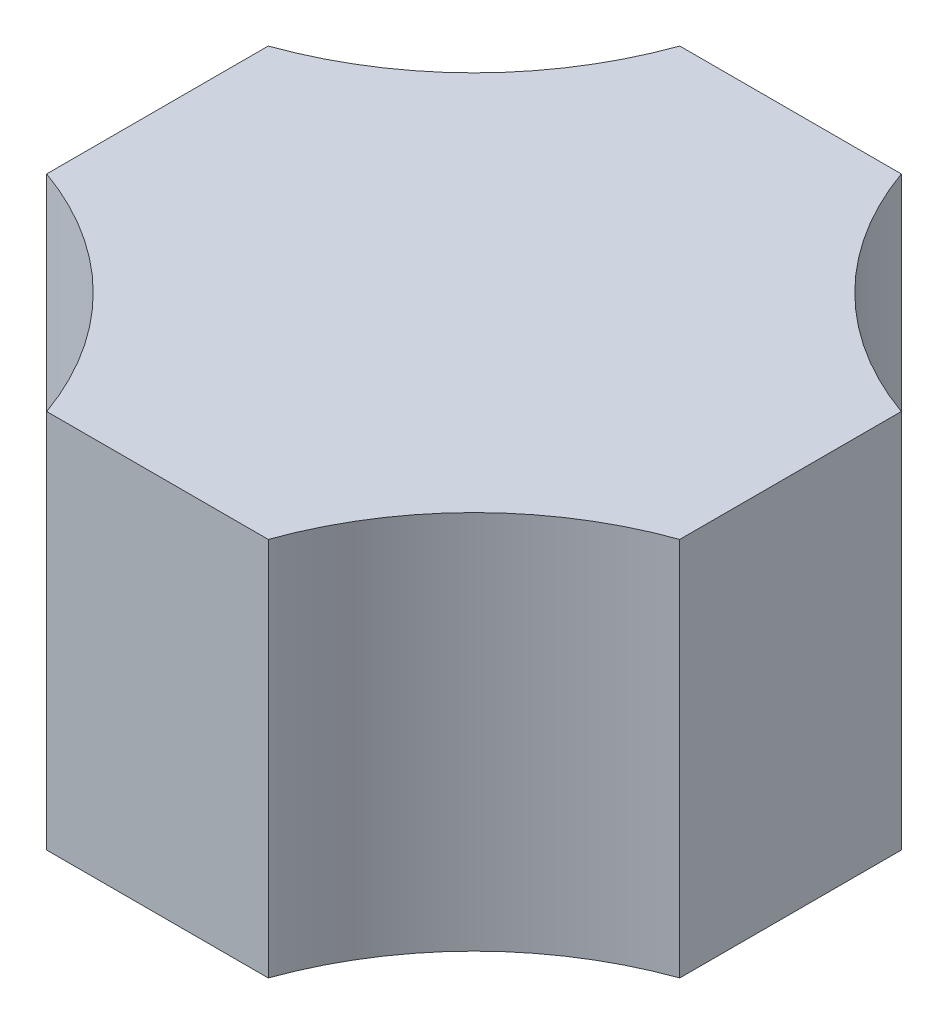
ISO-10303-21;
HEADER;
FILE_DESCRIPTION(('STEP AP214'),'2;1');
FILE_NAME('part.step','',(''),(''),'','','');
FILE_SCHEMA(('AUTOMOTIVE_DESIGN { 1 0 10303 214 1 1 1 1 }'));
ENDSEC;
DATA;
#1=APPLICATION_CONTEXT('core data for automotive mechanical design processes');
#2=APPLICATION_PROTOCOL_DEFINITION('international standard','automotive_design',2000,#1);
#3=PRODUCT_CONTEXT('',#1,'mechanical');
#4=PRODUCT('Part','Part','',(#3));
#5=PRODUCT_RELATED_PRODUCT_CATEGORY('part','',(#4));
#6=PRODUCT_DEFINITION_FORMATION('','',#4);
#7=PRODUCT_DEFINITION_CONTEXT('part definition',#1,'design');
#8=PRODUCT_DEFINITION('design','',#6,#7);
#9=PRODUCT_DEFINITION_SHAPE('','',#8);
#10=(LENGTH_UNIT() NAMED_UNIT(*) SI_UNIT(.MILLI.,.METRE.));
#11=(NAMED_UNIT(*) PLANE_ANGLE_UNIT() SI_UNIT($,.RADIAN.));
#12=(NAMED_UNIT(*) SI_UNIT($,.STERADIAN.) SOLID_ANGLE_UNIT());
#13=UNCERTAINTY_MEASURE_WITH_UNIT(LENGTH_MEASURE(1.E-05),#10,'distance_accuracy_value','');
#14=(GEOMETRIC_REPRESENTATION_CONTEXT(3) GLOBAL_UNCERTAINTY_ASSIGNED_CONTEXT((#13)) GLOBAL_UNIT_ASSIGNED_CONTEXT((#10,
#11,#12)) REPRESENTATION_CONTEXT('',''));
#15=CARTESIAN_POINT('',(0.,0.,0.));
#16=DIRECTION('',(0.,0.,1.));
#17=DIRECTION('',(1.,0.,0.));
#18=AXIS2_PLACEMENT_3D('',#15,#16,#17);
#19=CARTESIAN_POINT('',(-15.3850818282959,-15.24,-25.4));
#20=DIRECTION('',(0.,0.,1.));
#21=DIRECTION('',(1.,0.,0.));
#22=AXIS2_PLACEMENT_3D('',#19,#20,#21);
#23=PLANE('',#22);
#24=DIRECTION('',(1.,0.,0.));
#25=VECTOR('',#24,1.);
#26=CARTESIAN_POINT('',(-15.3850818282959,0.,-25.4));
#27=LINE('',#26,#25);
#28=CARTESIAN_POINT('',(8.255,0.,-25.4));
#29=VERTEX_POINT('',#28);
#30=CARTESIAN_POINT('',(17.145,0.,-25.4));
#31=VERTEX_POINT('',#30);
#32=EDGE_CURVE('E129',#29,#31,#27,.T.);
#33=ORIENTED_EDGE('',*,*,#32,.T.);
#34=DIRECTION('',(0.,1.,0.));
#35=VECTOR('',#34,1.);
#36=CARTESIAN_POINT('',(17.145,-15.24,-25.4));
#37=LINE('',#36,#35);
#38=CARTESIAN_POINT('',(17.145,-15.24,-25.4));
#39=VERTEX_POINT('',#38);
#40=EDGE_CURVE('E11',#39,#31,#37,.T.);
#41=ORIENTED_EDGE('',*,*,#40,.F.);
#42=DIRECTION('',(1.,0.,0.));
#43=VECTOR('',#42,1.);
#44=CARTESIAN_POINT('',(-15.3850818282959,-15.24,-25.4));
#45=LINE('',#44,#43);
#46=CARTESIAN_POINT('',(8.255,-15.24,-25.4));
#47=VERTEX_POINT('',#46);
#48=EDGE_CURVE('E145',#47,#39,#45,.T.);
#49=ORIENTED_EDGE('',*,*,#48,.F.);
#50=DIRECTION('',(0.,1.,0.));
#51=VECTOR('',#50,1.);
#52=CARTESIAN_POINT('',(8.255,-15.24,-25.4));
#53=LINE('',#52,#51);
#54=EDGE_CURVE('E36',#47,#29,#53,.T.);
#55=ORIENTED_EDGE('',*,*,#54,.T.);
#56=EDGE_LOOP('',(#33,#41,#49,#55));
#57=FACE_BOUND('',#56,.T.);
#58=ADVANCED_FACE('F33',(#57),#23,.F.);
#59=CARTESIAN_POINT('',(29.9332120435619,-15.24,-29.9332120435619));
#60=DIRECTION('',(0.,1.,0.));
#61=DIRECTION('',(0.,0.,1.));
#62=AXIS2_PLACEMENT_3D('',#59,#60,#61);
#63=CYLINDRICAL_SURFACE('',#62,13.5679172573758);
#64=CARTESIAN_POINT('',(29.9332120435619,0.,-29.9332120435619));
#65=DIRECTION('',(0.,1.,0.));
#66=DIRECTION('',(0.,0.,1.));
#67=AXIS2_PLACEMENT_3D('',#64,#65,#66);
#68=CIRCLE('',#67,13.5679172573758);
#69=CARTESIAN_POINT('',(25.4,0.,-17.145));
#70=VERTEX_POINT('',#69);
#71=EDGE_CURVE('E76',#31,#70,#68,.T.);
#72=ORIENTED_EDGE('',*,*,#71,.T.);
#73=DIRECTION('',(0.,1.,0.));
#74=VECTOR('',#73,1.);
#75=CARTESIAN_POINT('',(25.4,-15.24,-17.145));
#76=LINE('',#75,#74);
#77=CARTESIAN_POINT('',(25.4,-15.24,-17.145));
#78=VERTEX_POINT('',#77);
#79=EDGE_CURVE('E42',#78,#70,#76,.T.);
#80=ORIENTED_EDGE('',*,*,#79,.F.);
#81=CARTESIAN_POINT('',(29.9332120435619,-15.24,-29.9332120435619));
#82=DIRECTION('',(0.,1.,0.));
#83=DIRECTION('',(0.,0.,1.));
#84=AXIS2_PLACEMENT_3D('',#81,#82,#83);
#85=CIRCLE('',#84,13.5679172573758);
#86=EDGE_CURVE('E50',#39,#78,#85,.T.);
#87=ORIENTED_EDGE('',*,*,#86,.F.);
#88=ORIENTED_EDGE('',*,*,#40,.T.);
#89=EDGE_LOOP('',(#72,#80,#87,#88));
#90=FACE_BOUND('',#89,.T.);
#91=ADVANCED_FACE('F173',(#90),#63,.F.);
#92=CARTESIAN_POINT('',(25.4,-15.24,-12.7));
#93=DIRECTION('',(-1.,0.,0.));
#94=DIRECTION('',(0.,0.,1.));
#95=AXIS2_PLACEMENT_3D('',#92,#93,#94);
#96=PLANE('',#95);
#97=DIRECTION('',(0.,0.,1.));
#98=VECTOR('',#97,1.);
#99=CARTESIAN_POINT('',(25.4,0.,-12.7));
#100=LINE('',#99,#98);
#101=CARTESIAN_POINT('',(25.4,0.,-8.255));
#102=VERTEX_POINT('',#101);
#103=EDGE_CURVE('E114',#70,#102,#100,.T.);
#104=ORIENTED_EDGE('',*,*,#103,.T.);
#105=DIRECTION('',(0.,1.,0.));
#106=VECTOR('',#105,1.);
#107=CARTESIAN_POINT('',(25.4,-15.24,-8.255));
#108=LINE('',#107,#106);
#109=CARTESIAN_POINT('',(25.4,-15.24,-8.255));
#110=VERTEX_POINT('',#109);
#111=EDGE_CURVE('E112',#110,#102,#108,.T.);
#112=ORIENTED_EDGE('',*,*,#111,.F.);
#113=DIRECTION('',(0.,0.,1.));
#114=VECTOR('',#113,1.);
#115=CARTESIAN_POINT('',(25.4,-15.24,-12.7));
#116=LINE('',#115,#114);
#117=EDGE_CURVE('E104',#78,#110,#116,.T.);
#118=ORIENTED_EDGE('',*,*,#117,.F.);
#119=ORIENTED_EDGE('',*,*,#79,.T.);
#120=EDGE_LOOP('',(#104,#112,#118,#119));
#121=FACE_BOUND('',#120,.T.);
#122=ADVANCED_FACE('F113',(#121),#96,.F.);
#123=CARTESIAN_POINT('',(29.9332120435619,-15.24,4.53321204356189));
#124=DIRECTION('',(0.,1.,0.));
#125=DIRECTION('',(0.,0.,1.));
#126=AXIS2_PLACEMENT_3D('',#123,#124,#125);
#127=CYLINDRICAL_SURFACE('',#126,13.5679172573758);
#128=CARTESIAN_POINT('',(29.9332120435619,0.,4.53321204356189));
#129=DIRECTION('',(0.,1.,0.));
#130=DIRECTION('',(0.,0.,1.));
#131=AXIS2_PLACEMENT_3D('',#128,#129,#130);
#132=CIRCLE('',#131,13.5679172573758);
#133=CARTESIAN_POINT('',(17.145,0.,0.));
#134=VERTEX_POINT('',#133);
#135=EDGE_CURVE('E142',#134,#102,#132,.F.);
#136=ORIENTED_EDGE('',*,*,#135,.F.);
#137=DIRECTION('',(0.,1.,0.));
#138=VECTOR('',#137,1.);
#139=CARTESIAN_POINT('',(17.145,-15.24,0.));
#140=LINE('',#139,#138);
#141=CARTESIAN_POINT('',(17.145,-15.24,0.));
#142=VERTEX_POINT('',#141);
#143=EDGE_CURVE('E118',#142,#134,#140,.T.);
#144=ORIENTED_EDGE('',*,*,#143,.F.);
#145=CARTESIAN_POINT('',(29.9332120435619,-15.24,4.53321204356189));
#146=DIRECTION('',(0.,1.,0.));
#147=DIRECTION('',(0.,0.,1.));
#148=AXIS2_PLACEMENT_3D('',#145,#146,#147);
#149=CIRCLE('',#148,13.5679172573758);
#150=EDGE_CURVE('E108',#142,#110,#149,.F.);
#151=ORIENTED_EDGE('',*,*,#150,.T.);
#152=ORIENTED_EDGE('',*,*,#111,.T.);
#153=EDGE_LOOP('',(#136,#144,#151,#152));
#154=FACE_BOUND('',#153,.T.);
#155=ADVANCED_FACE('F120',(#154),#127,.F.);
#156=CARTESIAN_POINT('',(-15.3850818282959,-15.24,0.));
#157=DIRECTION('',(0.,0.,-1.));
#158=DIRECTION('',(-1.,0.,0.));
#159=AXIS2_PLACEMENT_3D('',#156,#157,#158);
#160=PLANE('',#159);
#161=DIRECTION('',(-1.,0.,0.));
#162=VECTOR('',#161,1.);
#163=CARTESIAN_POINT('',(-15.3850818282959,0.,0.));
#164=LINE('',#163,#162);
#165=CARTESIAN_POINT('',(8.255,0.,0.));
#166=VERTEX_POINT('',#165);
#167=EDGE_CURVE('E140',#134,#166,#164,.T.);
#168=ORIENTED_EDGE('',*,*,#167,.T.);
#169=DIRECTION('',(0.,1.,0.));
#170=VECTOR('',#169,1.);
#171=CARTESIAN_POINT('',(8.255,-15.24,0.));
#172=LINE('',#171,#170);
#173=CARTESIAN_POINT('',(8.255,-15.24,0.));
#174=VERTEX_POINT('',#173);
#175=EDGE_CURVE('E149',#174,#166,#172,.T.);
#176=ORIENTED_EDGE('',*,*,#175,.F.);
#177=DIRECTION('',(-1.,0.,0.));
#178=VECTOR('',#177,1.);
#179=CARTESIAN_POINT('',(-15.3850818282959,-15.24,0.));
#180=LINE('',#179,#178);
#181=EDGE_CURVE('E122',#142,#174,#180,.T.);
#182=ORIENTED_EDGE('',*,*,#181,.F.);
#183=ORIENTED_EDGE('',*,*,#143,.T.);
#184=EDGE_LOOP('',(#168,#176,#182,#183));
#185=FACE_BOUND('',#184,.T.);
#186=ADVANCED_FACE('F186',(#185),#160,.F.);
#187=CARTESIAN_POINT('',(-4.53321204356189,-15.24,4.53321204356189));
#188=DIRECTION('',(0.,1.,0.));
#189=DIRECTION('',(0.,0.,1.));
#190=AXIS2_PLACEMENT_3D('',#187,#188,#189);
#191=CYLINDRICAL_SURFACE('',#190,13.5679172573758);
#192=CARTESIAN_POINT('',(-4.53321204356189,0.,4.53321204356189));
#193=DIRECTION('',(0.,1.,0.));
#194=DIRECTION('',(0.,0.,1.));
#195=AXIS2_PLACEMENT_3D('',#192,#193,#194);
#196=CIRCLE('',#195,13.5679172573758);
#197=CARTESIAN_POINT('',(0.,0.,-8.255));
#198=VERTEX_POINT('',#197);
#199=EDGE_CURVE('E138',#166,#198,#196,.T.);
#200=ORIENTED_EDGE('',*,*,#199,.T.);
#201=DIRECTION('',(0.,1.,0.));
#202=VECTOR('',#201,1.);
#203=CARTESIAN_POINT('',(0.,-15.24,-8.255));
#204=LINE('',#203,#202);
#205=CARTESIAN_POINT('',(0.,-15.24,-8.255));
#206=VERTEX_POINT('',#205);
#207=EDGE_CURVE('E152',#206,#198,#204,.T.);
#208=ORIENTED_EDGE('',*,*,#207,.F.);
#209=CARTESIAN_POINT('',(-4.53321204356189,-15.24,4.53321204356189));
#210=DIRECTION('',(0.,1.,0.));
#211=DIRECTION('',(0.,0.,1.));
#212=AXIS2_PLACEMENT_3D('',#209,#210,#211);
#213=CIRCLE('',#212,13.5679172573758);
#214=EDGE_CURVE('E124',#174,#206,#213,.T.);
#215=ORIENTED_EDGE('',*,*,#214,.F.);
#216=ORIENTED_EDGE('',*,*,#175,.T.);
#217=EDGE_LOOP('',(#200,#208,#215,#216));
#218=FACE_BOUND('',#217,.T.);
#219=ADVANCED_FACE('F169',(#218),#191,.F.);
#220=CARTESIAN_POINT('',(0.,-15.24,-12.7));
#221=DIRECTION('',(1.,0.,0.));
#222=DIRECTION('',(0.,0.,-1.));
#223=AXIS2_PLACEMENT_3D('',#220,#221,#222);
#224=PLANE('',#223);
#225=DIRECTION('',(0.,0.,-1.));
#226=VECTOR('',#225,1.);
#227=CARTESIAN_POINT('',(0.,0.,-12.7));
#228=LINE('',#227,#226);
#229=CARTESIAN_POINT('',(0.,0.,-17.145));
#230=VERTEX_POINT('',#229);
#231=EDGE_CURVE('E135',#198,#230,#228,.T.);
#232=ORIENTED_EDGE('',*,*,#231,.T.);
#233=DIRECTION('',(0.,1.,0.));
#234=VECTOR('',#233,1.);
#235=CARTESIAN_POINT('',(0.,-15.24,-17.145));
#236=LINE('',#235,#234);
#237=CARTESIAN_POINT('',(0.,-15.24,-17.145));
#238=VERTEX_POINT('',#237);
#239=EDGE_CURVE('E154',#238,#230,#236,.T.);
#240=ORIENTED_EDGE('',*,*,#239,.F.);
#241=DIRECTION('',(0.,0.,-1.));
#242=VECTOR('',#241,1.);
#243=CARTESIAN_POINT('',(0.,-15.24,-12.7));
#244=LINE('',#243,#242);
#245=EDGE_CURVE('E200',#206,#238,#244,.T.);
#246=ORIENTED_EDGE('',*,*,#245,.F.);
#247=ORIENTED_EDGE('',*,*,#207,.T.);
#248=EDGE_LOOP('',(#232,#240,#246,#247));
#249=FACE_BOUND('',#248,.T.);
#250=ADVANCED_FACE('F163',(#249),#224,.F.);
#251=CARTESIAN_POINT('',(-4.53321204356189,-15.24,-29.9332120435619));
#252=DIRECTION('',(0.,1.,0.));
#253=DIRECTION('',(0.,0.,1.));
#254=AXIS2_PLACEMENT_3D('',#251,#252,#253);
#255=CYLINDRICAL_SURFACE('',#254,13.5679172573758);
#256=CARTESIAN_POINT('',(-4.53321204356189,0.,-29.9332120435619));
#257=DIRECTION('',(0.,1.,0.));
#258=DIRECTION('',(0.,0.,1.));
#259=AXIS2_PLACEMENT_3D('',#256,#257,#258);
#260=CIRCLE('',#259,13.5679172573758);
#261=EDGE_CURVE('E132',#29,#230,#260,.F.);
#262=ORIENTED_EDGE('',*,*,#261,.F.);
#263=ORIENTED_EDGE('',*,*,#54,.F.);
#264=CARTESIAN_POINT('',(-4.53321204356189,-15.24,-29.9332120435619));
#265=DIRECTION('',(0.,1.,0.));
#266=DIRECTION('',(0.,0.,1.));
#267=AXIS2_PLACEMENT_3D('',#264,#265,#266);
#268=CIRCLE('',#267,13.5679172573758);
#269=EDGE_CURVE('E201',#47,#238,#268,.F.);
#270=ORIENTED_EDGE('',*,*,#269,.T.);
#271=ORIENTED_EDGE('',*,*,#239,.T.);
#272=EDGE_LOOP('',(#262,#263,#270,#271));
#273=FACE_BOUND('',#272,.T.);
#274=ADVANCED_FACE('F161',(#273),#255,.F.);
#275=CARTESIAN_POINT('',(-15.3850818282959,-15.24,-12.7));
#276=DIRECTION('',(0.,1.,0.));
#277=DIRECTION('',(0.,0.,1.));
#278=AXIS2_PLACEMENT_3D('',#275,#276,#277);
#279=PLANE('',#278);
#280=ORIENTED_EDGE('',*,*,#48,.T.);
#281=ORIENTED_EDGE('',*,*,#86,.T.);
#282=ORIENTED_EDGE('',*,*,#117,.T.);
#283=ORIENTED_EDGE('',*,*,#150,.F.);
#284=ORIENTED_EDGE('',*,*,#181,.T.);
#285=ORIENTED_EDGE('',*,*,#214,.T.);
#286=ORIENTED_EDGE('',*,*,#245,.T.);
#287=ORIENTED_EDGE('',*,*,#269,.F.);
#288=EDGE_LOOP('',(#280,#281,#282,#283,#284,#285,#286,#287));
#289=FACE_BOUND('',#288,.T.);
#290=ADVANCED_FACE('F106',(#289),#279,.F.);
#291=CARTESIAN_POINT('',(-15.3850818282959,0.,-12.7));
#292=DIRECTION('',(0.,1.,0.));
#293=DIRECTION('',(0.,0.,1.));
#294=AXIS2_PLACEMENT_3D('',#291,#292,#293);
#295=PLANE('',#294);
#296=ORIENTED_EDGE('',*,*,#32,.F.);
#297=ORIENTED_EDGE('',*,*,#261,.T.);
#298=ORIENTED_EDGE('',*,*,#231,.F.);
#299=ORIENTED_EDGE('',*,*,#199,.F.);
#300=ORIENTED_EDGE('',*,*,#167,.F.);
#301=ORIENTED_EDGE('',*,*,#135,.T.);
#302=ORIENTED_EDGE('',*,*,#103,.F.);
#303=ORIENTED_EDGE('',*,*,#71,.F.);
#304=EDGE_LOOP('',(#296,#297,#298,#299,#300,#301,#302,#303));
#305=FACE_BOUND('',#304,.T.);
#306=ADVANCED_FACE('F159',(#305),#295,.T.);
#307=CLOSED_SHELL('',(#58,#91,#122,#155,#186,#219,#250,#274,#290,#306));
#308=MANIFOLD_SOLID_BREP('B2',#307);
#309=ADVANCED_BREP_SHAPE_REPRESENTATION('',(#18,#308),#14);
#310=SHAPE_DEFINITION_REPRESENTATION(#9,#309);
ENDSEC;
END-ISO-10303-21;
